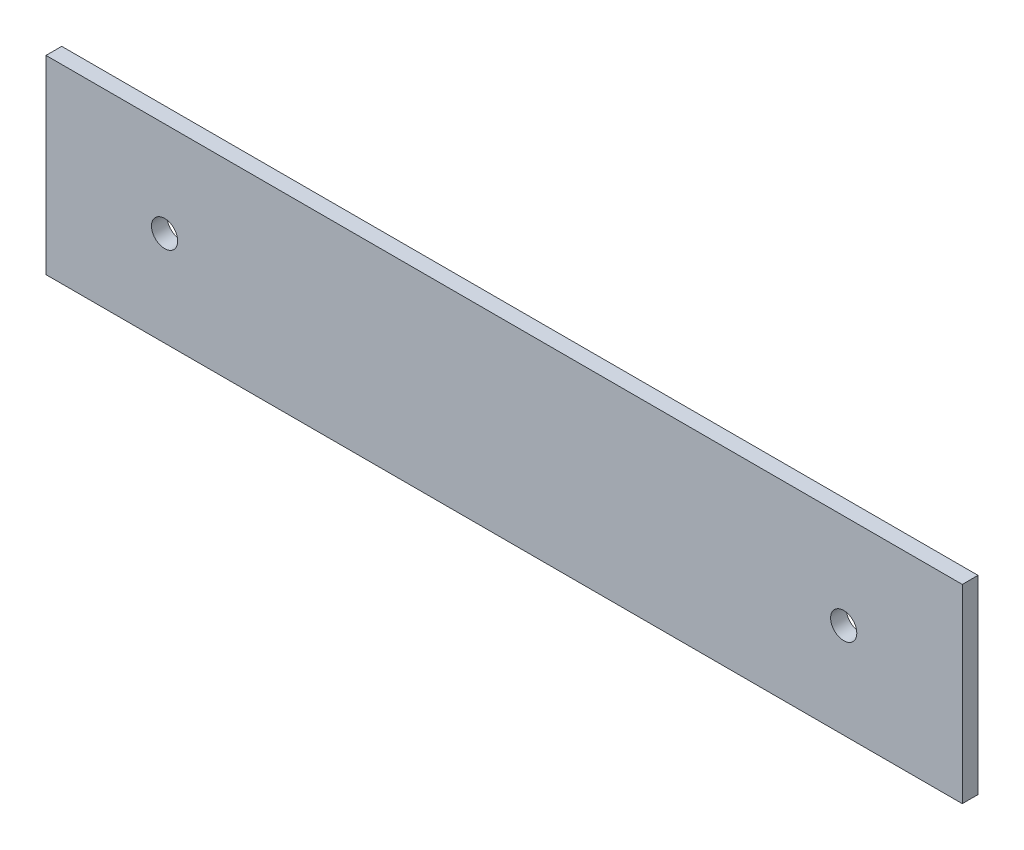
ISO-10303-21;
HEADER;
FILE_DESCRIPTION(('STEP AP214'),'2;1');
FILE_NAME('part.step','',(''),(''),'','','');
FILE_SCHEMA(('AUTOMOTIVE_DESIGN { 1 0 10303 214 1 1 1 1 }'));
ENDSEC;
DATA;
#1=APPLICATION_CONTEXT('core data for automotive mechanical design processes');
#2=APPLICATION_PROTOCOL_DEFINITION('international standard','automotive_design',2000,#1);
#3=PRODUCT_CONTEXT('',#1,'mechanical');
#4=PRODUCT('Part','Part','',(#3));
#5=PRODUCT_RELATED_PRODUCT_CATEGORY('part','',(#4));
#6=PRODUCT_DEFINITION_FORMATION('','',#4);
#7=PRODUCT_DEFINITION_CONTEXT('part definition',#1,'design');
#8=PRODUCT_DEFINITION('design','',#6,#7);
#9=PRODUCT_DEFINITION_SHAPE('','',#8);
#10=(LENGTH_UNIT() NAMED_UNIT(*) SI_UNIT(.MILLI.,.METRE.));
#11=(NAMED_UNIT(*) PLANE_ANGLE_UNIT() SI_UNIT($,.RADIAN.));
#12=(NAMED_UNIT(*) SI_UNIT($,.STERADIAN.) SOLID_ANGLE_UNIT());
#13=UNCERTAINTY_MEASURE_WITH_UNIT(LENGTH_MEASURE(1.E-05),#10,'distance_accuracy_value','');
#14=(GEOMETRIC_REPRESENTATION_CONTEXT(3) GLOBAL_UNCERTAINTY_ASSIGNED_CONTEXT((#13)) GLOBAL_UNIT_ASSIGNED_CONTEXT((#10,
#11,#12)) REPRESENTATION_CONTEXT('',''));
#15=CARTESIAN_POINT('',(0.,0.,0.));
#16=DIRECTION('',(0.,0.,1.));
#17=DIRECTION('',(1.,0.,0.));
#18=AXIS2_PLACEMENT_3D('',#15,#16,#17);
#19=CARTESIAN_POINT('',(-76.2817097489466,211.295712396778,1.16603894672108));
#20=DIRECTION('',(1.,0.,0.));
#21=DIRECTION('',(0.,0.,-1.));
#22=AXIS2_PLACEMENT_3D('',#19,#20,#21);
#23=PLANE('',#22);
#24=DIRECTION('',(0.,0.,1.));
#25=VECTOR('',#24,1.);
#26=CARTESIAN_POINT('',(-76.2817097489466,36.27,1.16603894672108));
#27=LINE('',#26,#25);
#28=CARTESIAN_POINT('',(-76.2817097489466,36.27,1.16603894672108));
#29=VERTEX_POINT('',#28);
#30=CARTESIAN_POINT('',(-76.2817097489466,36.27,4.16603894672113));
#31=VERTEX_POINT('',#30);
#32=EDGE_CURVE('E37',#29,#31,#27,.T.);
#33=ORIENTED_EDGE('',*,*,#32,.F.);
#34=DIRECTION('',(0.,-1.,0.));
#35=VECTOR('',#34,1.);
#36=CARTESIAN_POINT('',(-76.2817097489466,211.295712396778,1.16603894672108));
#37=LINE('',#36,#35);
#38=CARTESIAN_POINT('',(-76.2817097489466,0.,1.16603894672108));
#39=VERTEX_POINT('',#38);
#40=EDGE_CURVE('E91',#29,#39,#37,.T.);
#41=ORIENTED_EDGE('',*,*,#40,.T.);
#42=DIRECTION('',(0.,0.,1.));
#43=VECTOR('',#42,1.);
#44=CARTESIAN_POINT('',(-76.2817097489466,0.,1.16603894672108));
#45=LINE('',#44,#43);
#46=CARTESIAN_POINT('',(-76.2817097489466,0.,4.16603894672108));
#47=VERTEX_POINT('',#46);
#48=EDGE_CURVE('E86',#39,#47,#45,.T.);
#49=ORIENTED_EDGE('',*,*,#48,.T.);
#50=DIRECTION('',(0.,-1.,0.));
#51=VECTOR('',#50,1.);
#52=CARTESIAN_POINT('',(-76.2817097489466,211.295712396778,4.16603894672108));
#53=LINE('',#52,#51);
#54=EDGE_CURVE('E69',#31,#47,#53,.T.);
#55=ORIENTED_EDGE('',*,*,#54,.F.);
#56=EDGE_LOOP('',(#33,#41,#49,#55));
#57=FACE_BOUND('',#56,.T.);
#58=ADVANCED_FACE('F34',(#57),#23,.F.);
#59=CARTESIAN_POINT('',(-76.2817097489466,211.295712396778,4.16603894672108));
#60=DIRECTION('',(0.,0.,-1.));
#61=DIRECTION('',(-1.,0.,0.));
#62=AXIS2_PLACEMENT_3D('',#59,#60,#61);
#63=PLANE('',#62);
#64=CARTESIAN_POINT('',(-53.6317097489467,18.135,4.16603894672108));
#65=DIRECTION('',(0.,0.,1.));
#66=DIRECTION('',(1.,0.,0.));
#67=AXIS2_PLACEMENT_3D('',#64,#65,#66);
#68=CIRCLE('',#67,2.50000000000001);
#69=CARTESIAN_POINT('',(-51.1317097489467,18.135,4.16603894672108));
#70=VERTEX_POINT('',#69);
#71=EDGE_CURVE('E96',#70,#70,#68,.T.);
#72=ORIENTED_EDGE('',*,*,#71,.F.);
#73=EDGE_LOOP('',(#72));
#74=FACE_BOUND('',#73,.T.);
#75=CARTESIAN_POINT('',(76.0682902510533,18.135,4.16603894672108));
#76=DIRECTION('',(0.,0.,1.));
#77=DIRECTION('',(1.,0.,0.));
#78=AXIS2_PLACEMENT_3D('',#75,#76,#77);
#79=CIRCLE('',#78,2.49999999999999);
#80=CARTESIAN_POINT('',(78.5682902510533,18.135,4.16603894672108));
#81=VERTEX_POINT('',#80);
#82=EDGE_CURVE('E99',#81,#81,#79,.T.);
#83=ORIENTED_EDGE('',*,*,#82,.F.);
#84=EDGE_LOOP('',(#83));
#85=FACE_BOUND('',#84,.T.);
#86=DIRECTION('',(1.,0.,0.));
#87=VECTOR('',#86,1.);
#88=CARTESIAN_POINT('',(-76.2817097489466,36.27,4.16603894672108));
#89=LINE('',#88,#87);
#90=CARTESIAN_POINT('',(98.7182902510532,36.27,4.16603894672113));
#91=VERTEX_POINT('',#90);
#92=EDGE_CURVE('E76',#31,#91,#89,.T.);
#93=ORIENTED_EDGE('',*,*,#92,.F.);
#94=ORIENTED_EDGE('',*,*,#54,.T.);
#95=DIRECTION('',(1.,0.,0.));
#96=VECTOR('',#95,1.);
#97=CARTESIAN_POINT('',(-76.2817097489466,0.,4.16603894672108));
#98=LINE('',#97,#96);
#99=CARTESIAN_POINT('',(98.7182902510528,0.,4.16603894672108));
#100=VERTEX_POINT('',#99);
#101=EDGE_CURVE('E73',#47,#100,#98,.T.);
#102=ORIENTED_EDGE('',*,*,#101,.T.);
#103=DIRECTION('',(0.,-1.,0.));
#104=VECTOR('',#103,1.);
#105=CARTESIAN_POINT('',(98.7182902510528,211.295712396778,4.16603894672108));
#106=LINE('',#105,#104);
#107=EDGE_CURVE('E80',#91,#100,#106,.T.);
#108=ORIENTED_EDGE('',*,*,#107,.F.);
#109=EDGE_LOOP('',(#93,#94,#102,#108));
#110=FACE_BOUND('',#109,.T.);
#111=ADVANCED_FACE('F71',(#74,#85,#110),#63,.F.);
#112=CARTESIAN_POINT('',(98.7182902510528,211.295712396778,1.16603894672108));
#113=DIRECTION('',(-1.,0.,0.));
#114=DIRECTION('',(0.,0.,1.));
#115=AXIS2_PLACEMENT_3D('',#112,#113,#114);
#116=PLANE('',#115);
#117=DIRECTION('',(0.,0.,-1.));
#118=VECTOR('',#117,1.);
#119=CARTESIAN_POINT('',(98.7182902510528,36.27,1.16603894672108));
#120=LINE('',#119,#118);
#121=CARTESIAN_POINT('',(98.7182902510528,36.27,1.16603894672108));
#122=VERTEX_POINT('',#121);
#123=EDGE_CURVE('E79',#91,#122,#120,.T.);
#124=ORIENTED_EDGE('',*,*,#123,.F.);
#125=ORIENTED_EDGE('',*,*,#107,.T.);
#126=DIRECTION('',(0.,0.,-1.));
#127=VECTOR('',#126,1.);
#128=CARTESIAN_POINT('',(98.7182902510528,0.,1.16603894672108));
#129=LINE('',#128,#127);
#130=CARTESIAN_POINT('',(98.7182902510528,0.,1.16603894672108));
#131=VERTEX_POINT('',#130);
#132=EDGE_CURVE('E88',#100,#131,#129,.T.);
#133=ORIENTED_EDGE('',*,*,#132,.T.);
#134=DIRECTION('',(0.,-1.,0.));
#135=VECTOR('',#134,1.);
#136=CARTESIAN_POINT('',(98.7182902510528,211.295712396778,1.16603894672108));
#137=LINE('',#136,#135);
#138=EDGE_CURVE('E106',#122,#131,#137,.T.);
#139=ORIENTED_EDGE('',*,*,#138,.F.);
#140=EDGE_LOOP('',(#124,#125,#133,#139));
#141=FACE_BOUND('',#140,.T.);
#142=ADVANCED_FACE('F115',(#141),#116,.F.);
#143=CARTESIAN_POINT('',(-76.2817097489466,211.295712396778,1.16603894672108));
#144=DIRECTION('',(0.,0.,1.));
#145=DIRECTION('',(1.,0.,0.));
#146=AXIS2_PLACEMENT_3D('',#143,#144,#145);
#147=PLANE('',#146);
#148=CARTESIAN_POINT('',(-53.6317097489467,18.135,1.16603894672108));
#149=DIRECTION('',(0.,0.,1.));
#150=DIRECTION('',(1.,0.,0.));
#151=AXIS2_PLACEMENT_3D('',#148,#149,#150);
#152=CIRCLE('',#151,2.50000000000001);
#153=CARTESIAN_POINT('',(-51.1317097489467,18.135,1.16603894672108));
#154=VERTEX_POINT('',#153);
#155=EDGE_CURVE('E93',#154,#154,#152,.T.);
#156=ORIENTED_EDGE('',*,*,#155,.T.);
#157=EDGE_LOOP('',(#156));
#158=FACE_BOUND('',#157,.T.);
#159=CARTESIAN_POINT('',(76.0682902510533,18.135,1.16603894672108));
#160=DIRECTION('',(0.,0.,1.));
#161=DIRECTION('',(1.,0.,0.));
#162=AXIS2_PLACEMENT_3D('',#159,#160,#161);
#163=CIRCLE('',#162,2.49999999999999);
#164=CARTESIAN_POINT('',(78.5682902510533,18.135,1.16603894672108));
#165=VERTEX_POINT('',#164);
#166=EDGE_CURVE('E186',#165,#165,#163,.T.);
#167=ORIENTED_EDGE('',*,*,#166,.T.);
#168=EDGE_LOOP('',(#167));
#169=FACE_BOUND('',#168,.T.);
#170=DIRECTION('',(-1.,0.,0.));
#171=VECTOR('',#170,1.);
#172=CARTESIAN_POINT('',(-76.2817097489466,36.27,1.16603894672108));
#173=LINE('',#172,#171);
#174=EDGE_CURVE('E11',#122,#29,#173,.T.);
#175=ORIENTED_EDGE('',*,*,#174,.F.);
#176=ORIENTED_EDGE('',*,*,#138,.T.);
#177=DIRECTION('',(-1.,0.,0.));
#178=VECTOR('',#177,1.);
#179=CARTESIAN_POINT('',(-76.2817097489466,0.,1.16603894672108));
#180=LINE('',#179,#178);
#181=EDGE_CURVE('E103',#131,#39,#180,.T.);
#182=ORIENTED_EDGE('',*,*,#181,.T.);
#183=ORIENTED_EDGE('',*,*,#40,.F.);
#184=EDGE_LOOP('',(#175,#176,#182,#183));
#185=FACE_BOUND('',#184,.T.);
#186=ADVANCED_FACE('F112',(#158,#169,#185),#147,.F.);
#187=CARTESIAN_POINT('',(0.,0.,0.));
#188=DIRECTION('',(0.,1.,0.));
#189=DIRECTION('',(0.,0.,1.));
#190=AXIS2_PLACEMENT_3D('',#187,#188,#189);
#191=PLANE('',#190);
#192=ORIENTED_EDGE('',*,*,#48,.F.);
#193=ORIENTED_EDGE('',*,*,#181,.F.);
#194=ORIENTED_EDGE('',*,*,#132,.F.);
#195=ORIENTED_EDGE('',*,*,#101,.F.);
#196=EDGE_LOOP('',(#192,#193,#194,#195));
#197=FACE_BOUND('',#196,.T.);
#198=ADVANCED_FACE('F84',(#197),#191,.F.);
#199=CARTESIAN_POINT('',(-66.2817097489467,36.27,-234.120204463618));
#200=DIRECTION('',(0.,1.,0.));
#201=DIRECTION('',(-1.,0.,0.));
#202=AXIS2_PLACEMENT_3D('',#199,#200,#201);
#203=PLANE('',#202);
#204=ORIENTED_EDGE('',*,*,#174,.T.);
#205=ORIENTED_EDGE('',*,*,#32,.T.);
#206=ORIENTED_EDGE('',*,*,#92,.T.);
#207=ORIENTED_EDGE('',*,*,#123,.T.);
#208=EDGE_LOOP('',(#204,#205,#206,#207));
#209=FACE_BOUND('',#208,.T.);
#210=ADVANCED_FACE('F110',(#209),#203,.T.);
#211=CARTESIAN_POINT('',(76.0682902510533,18.135,1.16603894672108));
#212=DIRECTION('',(0.,0.,1.));
#213=DIRECTION('',(1.,0.,0.));
#214=AXIS2_PLACEMENT_3D('',#211,#212,#213);
#215=CYLINDRICAL_SURFACE('',#214,2.49999999999999);
#216=ORIENTED_EDGE('',*,*,#166,.F.);
#217=EDGE_LOOP('',(#216));
#218=FACE_BOUND('',#217,.T.);
#219=ORIENTED_EDGE('',*,*,#82,.T.);
#220=EDGE_LOOP('',(#219));
#221=FACE_BOUND('',#220,.T.);
#222=ADVANCED_FACE('F151',(#218,#221),#215,.F.);
#223=CARTESIAN_POINT('',(-53.6317097489467,18.135,1.16603894672108));
#224=DIRECTION('',(0.,0.,1.));
#225=DIRECTION('',(1.,0.,0.));
#226=AXIS2_PLACEMENT_3D('',#223,#224,#225);
#227=CYLINDRICAL_SURFACE('',#226,2.50000000000001);
#228=ORIENTED_EDGE('',*,*,#155,.F.);
#229=EDGE_LOOP('',(#228));
#230=FACE_BOUND('',#229,.T.);
#231=ORIENTED_EDGE('',*,*,#71,.T.);
#232=EDGE_LOOP('',(#231));
#233=FACE_BOUND('',#232,.T.);
#234=ADVANCED_FACE('F156',(#230,#233),#227,.F.);
#235=CLOSED_SHELL('',(#58,#111,#142,#186,#198,#210,#222,#234));
#236=MANIFOLD_SOLID_BREP('B2',#235);
#237=ADVANCED_BREP_SHAPE_REPRESENTATION('',(#18,#236),#14);
#238=SHAPE_DEFINITION_REPRESENTATION(#9,#237);
ENDSEC;
END-ISO-10303-21;
